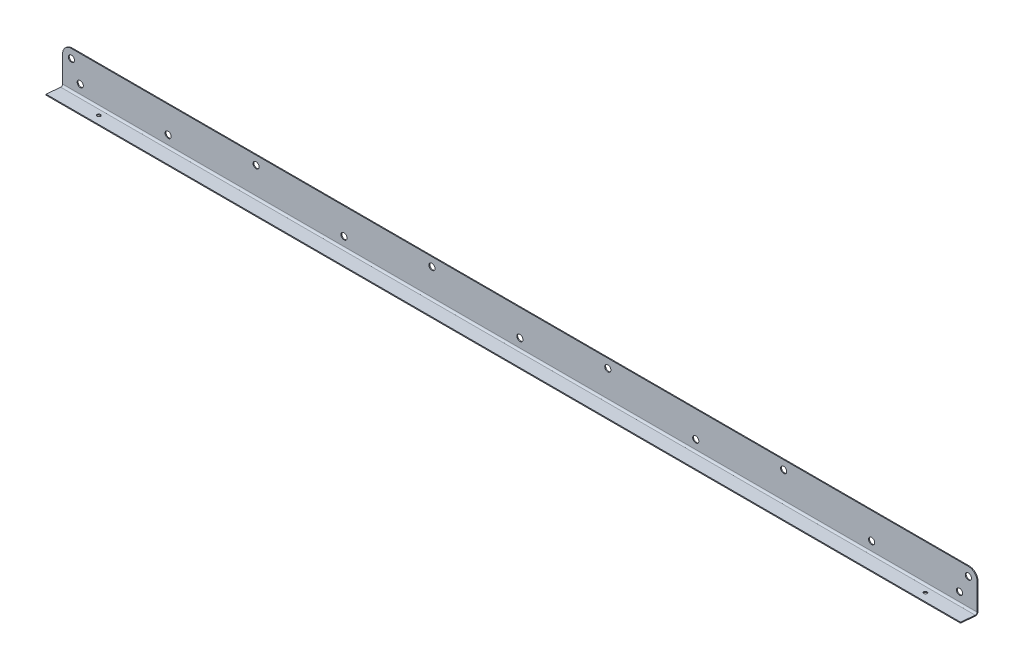
ISO-10303-21;
HEADER;
FILE_DESCRIPTION(('STEP AP214'),'2;1');
FILE_NAME('part.step','',(''),(''),'','','');
FILE_SCHEMA(('AUTOMOTIVE_DESIGN { 1 0 10303 214 1 1 1 1 }'));
ENDSEC;
DATA;
#1=APPLICATION_CONTEXT('core data for automotive mechanical design processes');
#2=APPLICATION_PROTOCOL_DEFINITION('international standard','automotive_design',2000,#1);
#3=PRODUCT_CONTEXT('',#1,'mechanical');
#4=PRODUCT('Part','Part','',(#3));
#5=PRODUCT_RELATED_PRODUCT_CATEGORY('part','',(#4));
#6=PRODUCT_DEFINITION_FORMATION('','',#4);
#7=PRODUCT_DEFINITION_CONTEXT('part definition',#1,'design');
#8=PRODUCT_DEFINITION('design','',#6,#7);
#9=PRODUCT_DEFINITION_SHAPE('','',#8);
#10=(LENGTH_UNIT() NAMED_UNIT(*) SI_UNIT(.MILLI.,.METRE.));
#11=(NAMED_UNIT(*) PLANE_ANGLE_UNIT() SI_UNIT($,.RADIAN.));
#12=(NAMED_UNIT(*) SI_UNIT($,.STERADIAN.) SOLID_ANGLE_UNIT());
#13=UNCERTAINTY_MEASURE_WITH_UNIT(LENGTH_MEASURE(1.E-05),#10,'distance_accuracy_value','');
#14=(GEOMETRIC_REPRESENTATION_CONTEXT(3) GLOBAL_UNCERTAINTY_ASSIGNED_CONTEXT((#13)) GLOBAL_UNIT_ASSIGNED_CONTEXT((#10,
#11,#12)) REPRESENTATION_CONTEXT('',''));
#15=CARTESIAN_POINT('',(0.,0.,0.));
#16=DIRECTION('',(0.,0.,1.));
#17=DIRECTION('',(1.,0.,0.));
#18=AXIS2_PLACEMENT_3D('',#15,#16,#17);
#19=CARTESIAN_POINT('',(510.,20.0000000000001,1.));
#20=DIRECTION('',(0.,1.,0.));
#21=DIRECTION('',(-1.,0.,0.));
#22=AXIS2_PLACEMENT_3D('',#19,#20,#21);
#23=PLANE('',#22);
#24=DIRECTION('',(0.,0.,1.));
#25=VECTOR('',#24,1.);
#26=CARTESIAN_POINT('',(510.,20.0000000000001,1.));
#27=LINE('',#26,#25);
#28=CARTESIAN_POINT('',(510.,20.0000000000001,1.));
#29=VERTEX_POINT('',#28);
#30=CARTESIAN_POINT('',(510.,20.0000000000001,2.));
#31=VERTEX_POINT('',#30);
#32=EDGE_CURVE('E13',#29,#31,#27,.T.);
#33=ORIENTED_EDGE('',*,*,#32,.F.);
#34=DIRECTION('',(-1.,0.,0.));
#35=VECTOR('',#34,1.);
#36=CARTESIAN_POINT('',(510.,20.0000000000001,1.));
#37=LINE('',#36,#35);
#38=CARTESIAN_POINT('',(-510.,20.,1.));
#39=VERTEX_POINT('',#38);
#40=EDGE_CURVE('E244',#29,#39,#37,.T.);
#41=ORIENTED_EDGE('',*,*,#40,.T.);
#42=DIRECTION('',(0.,0.,1.));
#43=VECTOR('',#42,1.);
#44=CARTESIAN_POINT('',(-510.,20.,1.));
#45=LINE('',#44,#43);
#46=CARTESIAN_POINT('',(-510.,20.,2.));
#47=VERTEX_POINT('',#46);
#48=EDGE_CURVE('E73',#39,#47,#45,.T.);
#49=ORIENTED_EDGE('',*,*,#48,.T.);
#50=DIRECTION('',(1.,0.,0.));
#51=VECTOR('',#50,1.);
#52=CARTESIAN_POINT('',(510.,20.0000000000001,2.));
#53=LINE('',#52,#51);
#54=EDGE_CURVE('E201',#31,#47,#53,.F.);
#55=ORIENTED_EDGE('',*,*,#54,.F.);
#56=EDGE_LOOP('',(#33,#41,#49,#55));
#57=FACE_BOUND('',#56,.T.);
#58=ADVANCED_FACE('F63',(#57),#23,.T.);
#59=CARTESIAN_POINT('',(-510.,9.99999999999996,1.));
#60=DIRECTION('',(0.,0.,1.));
#61=DIRECTION('',(1.,0.,0.));
#62=AXIS2_PLACEMENT_3D('',#59,#60,#61);
#63=CYLINDRICAL_SURFACE('',#62,10.);
#64=ORIENTED_EDGE('',*,*,#48,.F.);
#65=CARTESIAN_POINT('',(-510.,9.99999999999996,1.));
#66=DIRECTION('',(0.,0.,1.));
#67=DIRECTION('',(1.,0.,0.));
#68=AXIS2_PLACEMENT_3D('',#65,#66,#67);
#69=CIRCLE('',#68,10.);
#70=CARTESIAN_POINT('',(-520.,9.99999999999989,1.));
#71=VERTEX_POINT('',#70);
#72=EDGE_CURVE('E125',#39,#71,#69,.T.);
#73=ORIENTED_EDGE('',*,*,#72,.T.);
#74=DIRECTION('',(0.,0.,1.));
#75=VECTOR('',#74,1.);
#76=CARTESIAN_POINT('',(-520.,9.99999999999989,1.));
#77=LINE('',#76,#75);
#78=CARTESIAN_POINT('',(-520.,9.99999999999989,2.));
#79=VERTEX_POINT('',#78);
#80=EDGE_CURVE('E113',#71,#79,#77,.T.);
#81=ORIENTED_EDGE('',*,*,#80,.T.);
#82=CARTESIAN_POINT('',(-510.,9.99999999999996,2.));
#83=DIRECTION('',(0.,0.,1.));
#84=DIRECTION('',(1.,0.,0.));
#85=AXIS2_PLACEMENT_3D('',#82,#83,#84);
#86=CIRCLE('',#85,10.);
#87=EDGE_CURVE('E198',#47,#79,#86,.T.);
#88=ORIENTED_EDGE('',*,*,#87,.F.);
#89=EDGE_LOOP('',(#64,#73,#81,#88));
#90=FACE_BOUND('',#89,.T.);
#91=ADVANCED_FACE('F279',(#90),#63,.T.);
#92=CARTESIAN_POINT('',(-520.,-20.,1.));
#93=DIRECTION('',(-1.,0.,0.));
#94=DIRECTION('',(0.,-1.,0.));
#95=AXIS2_PLACEMENT_3D('',#92,#93,#94);
#96=PLANE('',#95);
#97=ORIENTED_EDGE('',*,*,#80,.F.);
#98=DIRECTION('',(0.,-1.,0.));
#99=VECTOR('',#98,1.);
#100=CARTESIAN_POINT('',(-520.,-20.,1.));
#101=LINE('',#100,#99);
#102=CARTESIAN_POINT('',(-520.,-20.,1.));
#103=VERTEX_POINT('',#102);
#104=EDGE_CURVE('E115',#71,#103,#101,.T.);
#105=ORIENTED_EDGE('',*,*,#104,.T.);
#106=DIRECTION('',(0.,0.,1.));
#107=VECTOR('',#106,1.);
#108=CARTESIAN_POINT('',(-520.,-20.,1.));
#109=LINE('',#108,#107);
#110=CARTESIAN_POINT('',(-520.,-20.,2.));
#111=VERTEX_POINT('',#110);
#112=EDGE_CURVE('E119',#103,#111,#109,.T.);
#113=ORIENTED_EDGE('',*,*,#112,.T.);
#114=DIRECTION('',(0.,1.,0.));
#115=VECTOR('',#114,1.);
#116=CARTESIAN_POINT('',(-520.,10.0000000000001,2.));
#117=LINE('',#116,#115);
#118=EDGE_CURVE('E196',#79,#111,#117,.F.);
#119=ORIENTED_EDGE('',*,*,#118,.F.);
#120=EDGE_LOOP('',(#97,#105,#113,#119));
#121=FACE_BOUND('',#120,.T.);
#122=ADVANCED_FACE('F117',(#121),#96,.T.);
#123=CARTESIAN_POINT('',(520.,-19.9999999999999,1.));
#124=DIRECTION('',(1.,0.,0.));
#125=DIRECTION('',(0.,1.,0.));
#126=AXIS2_PLACEMENT_3D('',#123,#124,#125);
#127=PLANE('',#126);
#128=DIRECTION('',(0.,0.,1.));
#129=VECTOR('',#128,1.);
#130=CARTESIAN_POINT('',(520.,-19.9999999999999,1.));
#131=LINE('',#130,#129);
#132=CARTESIAN_POINT('',(520.,-19.9999999999999,0.999999999999902));
#133=VERTEX_POINT('',#132);
#134=CARTESIAN_POINT('',(520.,-19.9999999999999,2.));
#135=VERTEX_POINT('',#134);
#136=EDGE_CURVE('E150',#133,#135,#131,.T.);
#137=ORIENTED_EDGE('',*,*,#136,.F.);
#138=DIRECTION('',(0.,1.,0.));
#139=VECTOR('',#138,1.);
#140=CARTESIAN_POINT('',(520.,-19.9999999999999,1.));
#141=LINE('',#140,#139);
#142=CARTESIAN_POINT('',(520.,10.,1.));
#143=VERTEX_POINT('',#142);
#144=EDGE_CURVE('E133',#133,#143,#141,.T.);
#145=ORIENTED_EDGE('',*,*,#144,.T.);
#146=DIRECTION('',(0.,0.,1.));
#147=VECTOR('',#146,1.);
#148=CARTESIAN_POINT('',(520.,10.,1.));
#149=LINE('',#148,#147);
#150=CARTESIAN_POINT('',(520.,10.,2.));
#151=VERTEX_POINT('',#150);
#152=EDGE_CURVE('E67',#143,#151,#149,.T.);
#153=ORIENTED_EDGE('',*,*,#152,.T.);
#154=DIRECTION('',(0.,1.,0.));
#155=VECTOR('',#154,1.);
#156=CARTESIAN_POINT('',(520.,10.0000000000001,2.));
#157=LINE('',#156,#155);
#158=EDGE_CURVE('E81',#135,#151,#157,.T.);
#159=ORIENTED_EDGE('',*,*,#158,.F.);
#160=EDGE_LOOP('',(#137,#145,#153,#159));
#161=FACE_BOUND('',#160,.T.);
#162=ADVANCED_FACE('F282',(#161),#127,.T.);
#163=CARTESIAN_POINT('',(400.,-10.0000000000001,1.));
#164=DIRECTION('',(0.,0.,1.));
#165=DIRECTION('',(1.,0.,0.));
#166=AXIS2_PLACEMENT_3D('',#163,#164,#165);
#167=CYLINDRICAL_SURFACE('',#166,3.50000000000002);
#168=CARTESIAN_POINT('',(400.,-10.0000000000001,2.));
#169=DIRECTION('',(0.,0.,1.));
#170=DIRECTION('',(1.,0.,0.));
#171=AXIS2_PLACEMENT_3D('',#168,#169,#170);
#172=CIRCLE('',#171,3.50000000000002);
#173=CARTESIAN_POINT('',(403.5,-10.0000000000001,2.));
#174=VERTEX_POINT('',#173);
#175=EDGE_CURVE('E172',#174,#174,#172,.T.);
#176=ORIENTED_EDGE('',*,*,#175,.T.);
#177=EDGE_LOOP('',(#176));
#178=FACE_BOUND('',#177,.T.);
#179=CARTESIAN_POINT('',(400.,-10.0000000000001,1.));
#180=DIRECTION('',(0.,0.,1.));
#181=DIRECTION('',(1.,0.,0.));
#182=AXIS2_PLACEMENT_3D('',#179,#180,#181);
#183=CIRCLE('',#182,3.50000000000002);
#184=CARTESIAN_POINT('',(403.5,-10.0000000000001,1.));
#185=VERTEX_POINT('',#184);
#186=EDGE_CURVE('E156',#185,#185,#183,.T.);
#187=ORIENTED_EDGE('',*,*,#186,.F.);
#188=EDGE_LOOP('',(#187));
#189=FACE_BOUND('',#188,.T.);
#190=ADVANCED_FACE('F429',(#178,#189),#167,.F.);
#191=CARTESIAN_POINT('',(-1.11022302462516E-13,-10.0000000000001,1.));
#192=DIRECTION('',(0.,0.,1.));
#193=DIRECTION('',(1.,0.,0.));
#194=AXIS2_PLACEMENT_3D('',#191,#192,#193);
#195=CYLINDRICAL_SURFACE('',#194,3.50000000000002);
#196=CARTESIAN_POINT('',(-1.11022302462516E-13,-10.0000000000001,2.));
#197=DIRECTION('',(0.,0.,1.));
#198=DIRECTION('',(1.,0.,0.));
#199=AXIS2_PLACEMENT_3D('',#196,#197,#198);
#200=CIRCLE('',#199,3.50000000000002);
#201=CARTESIAN_POINT('',(3.49999999999991,-10.0000000000001,2.));
#202=VERTEX_POINT('',#201);
#203=EDGE_CURVE('E175',#202,#202,#200,.T.);
#204=ORIENTED_EDGE('',*,*,#203,.T.);
#205=EDGE_LOOP('',(#204));
#206=FACE_BOUND('',#205,.T.);
#207=CARTESIAN_POINT('',(-1.11022302462516E-13,-10.0000000000001,1.));
#208=DIRECTION('',(0.,0.,1.));
#209=DIRECTION('',(1.,0.,0.));
#210=AXIS2_PLACEMENT_3D('',#207,#208,#209);
#211=CIRCLE('',#210,3.50000000000002);
#212=CARTESIAN_POINT('',(3.49999999999991,-10.0000000000001,1.));
#213=VERTEX_POINT('',#212);
#214=EDGE_CURVE('E160',#213,#213,#211,.T.);
#215=ORIENTED_EDGE('',*,*,#214,.F.);
#216=EDGE_LOOP('',(#215));
#217=FACE_BOUND('',#216,.T.);
#218=ADVANCED_FACE('F432',(#206,#217),#195,.F.);
#219=CARTESIAN_POINT('',(-500.,-10.0000000000001,1.));
#220=DIRECTION('',(0.,0.,1.));
#221=DIRECTION('',(1.,0.,0.));
#222=AXIS2_PLACEMENT_3D('',#219,#220,#221);
#223=CYLINDRICAL_SURFACE('',#222,3.50000000000002);
#224=CARTESIAN_POINT('',(-500.,-10.0000000000001,2.));
#225=DIRECTION('',(0.,0.,1.));
#226=DIRECTION('',(1.,0.,0.));
#227=AXIS2_PLACEMENT_3D('',#224,#225,#226);
#228=CIRCLE('',#227,3.50000000000002);
#229=CARTESIAN_POINT('',(-496.5,-10.0000000000001,2.));
#230=VERTEX_POINT('',#229);
#231=EDGE_CURVE('E179',#230,#230,#228,.T.);
#232=ORIENTED_EDGE('',*,*,#231,.T.);
#233=EDGE_LOOP('',(#232));
#234=FACE_BOUND('',#233,.T.);
#235=CARTESIAN_POINT('',(-500.,-10.0000000000001,1.));
#236=DIRECTION('',(0.,0.,1.));
#237=DIRECTION('',(1.,0.,0.));
#238=AXIS2_PLACEMENT_3D('',#235,#236,#237);
#239=CIRCLE('',#238,3.50000000000002);
#240=CARTESIAN_POINT('',(-496.5,-10.0000000000001,1.));
#241=VERTEX_POINT('',#240);
#242=EDGE_CURVE('E228',#241,#241,#239,.T.);
#243=ORIENTED_EDGE('',*,*,#242,.F.);
#244=EDGE_LOOP('',(#243));
#245=FACE_BOUND('',#244,.T.);
#246=ADVANCED_FACE('F436',(#234,#245),#223,.F.);
#247=CARTESIAN_POINT('',(-510.,9.99999999999995,1.));
#248=DIRECTION('',(0.,0.,1.));
#249=DIRECTION('',(1.,0.,0.));
#250=AXIS2_PLACEMENT_3D('',#247,#248,#249);
#251=CYLINDRICAL_SURFACE('',#250,3.50000000000008);
#252=CARTESIAN_POINT('',(-510.,9.99999999999995,2.));
#253=DIRECTION('',(0.,0.,1.));
#254=DIRECTION('',(1.,0.,0.));
#255=AXIS2_PLACEMENT_3D('',#252,#253,#254);
#256=CIRCLE('',#255,3.50000000000008);
#257=CARTESIAN_POINT('',(-506.5,9.99999999999995,2.));
#258=VERTEX_POINT('',#257);
#259=EDGE_CURVE('E182',#258,#258,#256,.T.);
#260=ORIENTED_EDGE('',*,*,#259,.T.);
#261=EDGE_LOOP('',(#260));
#262=FACE_BOUND('',#261,.T.);
#263=CARTESIAN_POINT('',(-510.,9.99999999999995,1.));
#264=DIRECTION('',(0.,0.,1.));
#265=DIRECTION('',(1.,0.,0.));
#266=AXIS2_PLACEMENT_3D('',#263,#264,#265);
#267=CIRCLE('',#266,3.50000000000008);
#268=CARTESIAN_POINT('',(-506.5,9.99999999999995,1.));
#269=VERTEX_POINT('',#268);
#270=EDGE_CURVE('E231',#269,#269,#267,.T.);
#271=ORIENTED_EDGE('',*,*,#270,.F.);
#272=EDGE_LOOP('',(#271));
#273=FACE_BOUND('',#272,.T.);
#274=ADVANCED_FACE('F440',(#262,#273),#251,.F.);
#275=CARTESIAN_POINT('',(99.9999999999999,9.99999999999995,1.));
#276=DIRECTION('',(0.,0.,1.));
#277=DIRECTION('',(1.,0.,0.));
#278=AXIS2_PLACEMENT_3D('',#275,#276,#277);
#279=CYLINDRICAL_SURFACE('',#278,3.49999999999996);
#280=CARTESIAN_POINT('',(99.9999999999999,9.99999999999995,2.));
#281=DIRECTION('',(0.,0.,1.));
#282=DIRECTION('',(1.,0.,0.));
#283=AXIS2_PLACEMENT_3D('',#280,#281,#282);
#284=CIRCLE('',#283,3.49999999999996);
#285=CARTESIAN_POINT('',(103.5,9.99999999999995,2.));
#286=VERTEX_POINT('',#285);
#287=EDGE_CURVE('E185',#286,#286,#284,.T.);
#288=ORIENTED_EDGE('',*,*,#287,.T.);
#289=EDGE_LOOP('',(#288));
#290=FACE_BOUND('',#289,.T.);
#291=CARTESIAN_POINT('',(99.9999999999999,9.99999999999995,1.));
#292=DIRECTION('',(0.,0.,1.));
#293=DIRECTION('',(1.,0.,0.));
#294=AXIS2_PLACEMENT_3D('',#291,#292,#293);
#295=CIRCLE('',#294,3.49999999999996);
#296=CARTESIAN_POINT('',(103.5,9.99999999999995,1.));
#297=VERTEX_POINT('',#296);
#298=EDGE_CURVE('E234',#297,#297,#295,.T.);
#299=ORIENTED_EDGE('',*,*,#298,.F.);
#300=EDGE_LOOP('',(#299));
#301=FACE_BOUND('',#300,.T.);
#302=ADVANCED_FACE('F444',(#290,#301),#279,.F.);
#303=CARTESIAN_POINT('',(-400.,-10.0000000000001,1.));
#304=DIRECTION('',(0.,0.,1.));
#305=DIRECTION('',(1.,0.,0.));
#306=AXIS2_PLACEMENT_3D('',#303,#304,#305);
#307=CYLINDRICAL_SURFACE('',#306,3.50000000000002);
#308=CARTESIAN_POINT('',(-400.,-10.0000000000001,2.));
#309=DIRECTION('',(0.,0.,1.));
#310=DIRECTION('',(1.,0.,0.));
#311=AXIS2_PLACEMENT_3D('',#308,#309,#310);
#312=CIRCLE('',#311,3.50000000000002);
#313=CARTESIAN_POINT('',(-396.5,-10.0000000000001,2.));
#314=VERTEX_POINT('',#313);
#315=EDGE_CURVE('E188',#314,#314,#312,.T.);
#316=ORIENTED_EDGE('',*,*,#315,.T.);
#317=EDGE_LOOP('',(#316));
#318=FACE_BOUND('',#317,.T.);
#319=CARTESIAN_POINT('',(-400.,-10.0000000000001,1.));
#320=DIRECTION('',(0.,0.,1.));
#321=DIRECTION('',(1.,0.,0.));
#322=AXIS2_PLACEMENT_3D('',#319,#320,#321);
#323=CIRCLE('',#322,3.50000000000002);
#324=CARTESIAN_POINT('',(-396.5,-10.0000000000001,1.));
#325=VERTEX_POINT('',#324);
#326=EDGE_CURVE('E237',#325,#325,#323,.T.);
#327=ORIENTED_EDGE('',*,*,#326,.F.);
#328=EDGE_LOOP('',(#327));
#329=FACE_BOUND('',#328,.T.);
#330=ADVANCED_FACE('F383',(#318,#329),#307,.F.);
#331=CARTESIAN_POINT('',(510.,10.0000000000001,1.));
#332=DIRECTION('',(0.,0.,1.));
#333=DIRECTION('',(1.,0.,0.));
#334=AXIS2_PLACEMENT_3D('',#331,#332,#333);
#335=CYLINDRICAL_SURFACE('',#334,10.);
#336=CARTESIAN_POINT('',(510.,10.0000000000001,1.));
#337=DIRECTION('',(0.,0.,1.));
#338=DIRECTION('',(1.,0.,0.));
#339=AXIS2_PLACEMENT_3D('',#336,#337,#338);
#340=CIRCLE('',#339,10.);
#341=EDGE_CURVE('E241',#143,#29,#340,.T.);
#342=ORIENTED_EDGE('',*,*,#341,.T.);
#343=ORIENTED_EDGE('',*,*,#32,.T.);
#344=CARTESIAN_POINT('',(510.,10.0000000000001,2.));
#345=DIRECTION('',(0.,0.,1.));
#346=DIRECTION('',(1.,0.,0.));
#347=AXIS2_PLACEMENT_3D('',#344,#345,#346);
#348=CIRCLE('',#347,10.);
#349=EDGE_CURVE('E192',#151,#31,#348,.T.);
#350=ORIENTED_EDGE('',*,*,#349,.F.);
#351=ORIENTED_EDGE('',*,*,#152,.F.);
#352=EDGE_LOOP('',(#342,#343,#350,#351));
#353=FACE_BOUND('',#352,.T.);
#354=ADVANCED_FACE('F281',(#353),#335,.T.);
#355=CARTESIAN_POINT('',(-300.,9.99999999999995,1.));
#356=DIRECTION('',(0.,0.,1.));
#357=DIRECTION('',(1.,0.,0.));
#358=AXIS2_PLACEMENT_3D('',#355,#356,#357);
#359=CYLINDRICAL_SURFACE('',#358,3.49999999999996);
#360=CARTESIAN_POINT('',(-300.,9.99999999999995,2.));
#361=DIRECTION('',(0.,0.,1.));
#362=DIRECTION('',(1.,0.,0.));
#363=AXIS2_PLACEMENT_3D('',#360,#361,#362);
#364=CIRCLE('',#363,3.49999999999996);
#365=CARTESIAN_POINT('',(-296.5,9.99999999999995,2.));
#366=VERTEX_POINT('',#365);
#367=EDGE_CURVE('E195',#366,#366,#364,.T.);
#368=ORIENTED_EDGE('',*,*,#367,.T.);
#369=EDGE_LOOP('',(#368));
#370=FACE_BOUND('',#369,.T.);
#371=CARTESIAN_POINT('',(-300.,9.99999999999995,1.));
#372=DIRECTION('',(0.,0.,1.));
#373=DIRECTION('',(1.,0.,0.));
#374=AXIS2_PLACEMENT_3D('',#371,#372,#373);
#375=CIRCLE('',#374,3.49999999999996);
#376=CARTESIAN_POINT('',(-296.5,9.99999999999995,1.));
#377=VERTEX_POINT('',#376);
#378=EDGE_CURVE('E138',#377,#377,#375,.T.);
#379=ORIENTED_EDGE('',*,*,#378,.F.);
#380=EDGE_LOOP('',(#379));
#381=FACE_BOUND('',#380,.T.);
#382=ADVANCED_FACE('F382',(#370,#381),#359,.F.);
#383=CARTESIAN_POINT('',(-100.,9.99999999999995,1.));
#384=DIRECTION('',(0.,0.,1.));
#385=DIRECTION('',(1.,0.,0.));
#386=AXIS2_PLACEMENT_3D('',#383,#384,#385);
#387=CYLINDRICAL_SURFACE('',#386,3.49999999999996);
#388=CARTESIAN_POINT('',(-100.,9.99999999999995,2.));
#389=DIRECTION('',(0.,0.,1.));
#390=DIRECTION('',(1.,0.,0.));
#391=AXIS2_PLACEMENT_3D('',#388,#389,#390);
#392=CIRCLE('',#391,3.49999999999996);
#393=CARTESIAN_POINT('',(-96.5000000000002,9.99999999999995,2.));
#394=VERTEX_POINT('',#393);
#395=EDGE_CURVE('E208',#394,#394,#392,.T.);
#396=ORIENTED_EDGE('',*,*,#395,.T.);
#397=EDGE_LOOP('',(#396));
#398=FACE_BOUND('',#397,.T.);
#399=CARTESIAN_POINT('',(-100.,9.99999999999995,1.));
#400=DIRECTION('',(0.,0.,1.));
#401=DIRECTION('',(1.,0.,0.));
#402=AXIS2_PLACEMENT_3D('',#399,#400,#401);
#403=CIRCLE('',#402,3.49999999999996);
#404=CARTESIAN_POINT('',(-96.5000000000002,9.99999999999995,1.));
#405=VERTEX_POINT('',#404);
#406=EDGE_CURVE('E250',#405,#405,#403,.T.);
#407=ORIENTED_EDGE('',*,*,#406,.F.);
#408=EDGE_LOOP('',(#407));
#409=FACE_BOUND('',#408,.T.);
#410=ADVANCED_FACE('F386',(#398,#409),#387,.F.);
#411=CARTESIAN_POINT('',(300.,9.99999999999995,1.));
#412=DIRECTION('',(0.,0.,1.));
#413=DIRECTION('',(1.,0.,0.));
#414=AXIS2_PLACEMENT_3D('',#411,#412,#413);
#415=CYLINDRICAL_SURFACE('',#414,3.49999999999996);
#416=CARTESIAN_POINT('',(300.,9.99999999999995,2.));
#417=DIRECTION('',(0.,0.,1.));
#418=DIRECTION('',(1.,0.,0.));
#419=AXIS2_PLACEMENT_3D('',#416,#417,#418);
#420=CIRCLE('',#419,3.49999999999996);
#421=CARTESIAN_POINT('',(303.5,9.99999999999995,2.));
#422=VERTEX_POINT('',#421);
#423=EDGE_CURVE('E211',#422,#422,#420,.T.);
#424=ORIENTED_EDGE('',*,*,#423,.T.);
#425=EDGE_LOOP('',(#424));
#426=FACE_BOUND('',#425,.T.);
#427=CARTESIAN_POINT('',(300.,9.99999999999995,1.));
#428=DIRECTION('',(0.,0.,1.));
#429=DIRECTION('',(1.,0.,0.));
#430=AXIS2_PLACEMENT_3D('',#427,#428,#429);
#431=CIRCLE('',#430,3.49999999999996);
#432=CARTESIAN_POINT('',(303.5,9.99999999999995,1.));
#433=VERTEX_POINT('',#432);
#434=EDGE_CURVE('E253',#433,#433,#431,.T.);
#435=ORIENTED_EDGE('',*,*,#434,.F.);
#436=EDGE_LOOP('',(#435));
#437=FACE_BOUND('',#436,.T.);
#438=ADVANCED_FACE('F390',(#426,#437),#415,.F.);
#439=CARTESIAN_POINT('',(510.,9.99999999999995,1.));
#440=DIRECTION('',(0.,0.,1.));
#441=DIRECTION('',(1.,0.,0.));
#442=AXIS2_PLACEMENT_3D('',#439,#440,#441);
#443=CYLINDRICAL_SURFACE('',#442,3.50000000000008);
#444=CARTESIAN_POINT('',(510.,9.99999999999995,2.));
#445=DIRECTION('',(0.,0.,1.));
#446=DIRECTION('',(1.,0.,0.));
#447=AXIS2_PLACEMENT_3D('',#444,#445,#446);
#448=CIRCLE('',#447,3.50000000000008);
#449=CARTESIAN_POINT('',(513.5,9.99999999999995,2.));
#450=VERTEX_POINT('',#449);
#451=EDGE_CURVE('E214',#450,#450,#448,.T.);
#452=ORIENTED_EDGE('',*,*,#451,.T.);
#453=EDGE_LOOP('',(#452));
#454=FACE_BOUND('',#453,.T.);
#455=CARTESIAN_POINT('',(510.,9.99999999999995,1.));
#456=DIRECTION('',(0.,0.,1.));
#457=DIRECTION('',(1.,0.,0.));
#458=AXIS2_PLACEMENT_3D('',#455,#456,#457);
#459=CIRCLE('',#458,3.50000000000008);
#460=CARTESIAN_POINT('',(513.5,9.99999999999995,1.));
#461=VERTEX_POINT('',#460);
#462=EDGE_CURVE('E256',#461,#461,#459,.T.);
#463=ORIENTED_EDGE('',*,*,#462,.F.);
#464=EDGE_LOOP('',(#463));
#465=FACE_BOUND('',#464,.T.);
#466=ADVANCED_FACE('F394',(#454,#465),#443,.F.);
#467=CARTESIAN_POINT('',(-200.,-10.0000000000001,1.));
#468=DIRECTION('',(0.,0.,1.));
#469=DIRECTION('',(1.,0.,0.));
#470=AXIS2_PLACEMENT_3D('',#467,#468,#469);
#471=CYLINDRICAL_SURFACE('',#470,3.50000000000002);
#472=CARTESIAN_POINT('',(-200.,-10.0000000000001,2.));
#473=DIRECTION('',(0.,0.,1.));
#474=DIRECTION('',(1.,0.,0.));
#475=AXIS2_PLACEMENT_3D('',#472,#473,#474);
#476=CIRCLE('',#475,3.50000000000002);
#477=CARTESIAN_POINT('',(-196.5,-10.0000000000001,2.));
#478=VERTEX_POINT('',#477);
#479=EDGE_CURVE('E217',#478,#478,#476,.T.);
#480=ORIENTED_EDGE('',*,*,#479,.T.);
#481=EDGE_LOOP('',(#480));
#482=FACE_BOUND('',#481,.T.);
#483=CARTESIAN_POINT('',(-200.,-10.0000000000001,1.));
#484=DIRECTION('',(0.,0.,1.));
#485=DIRECTION('',(1.,0.,0.));
#486=AXIS2_PLACEMENT_3D('',#483,#484,#485);
#487=CIRCLE('',#486,3.50000000000002);
#488=CARTESIAN_POINT('',(-196.5,-10.0000000000001,1.));
#489=VERTEX_POINT('',#488);
#490=EDGE_CURVE('E259',#489,#489,#487,.T.);
#491=ORIENTED_EDGE('',*,*,#490,.F.);
#492=EDGE_LOOP('',(#491));
#493=FACE_BOUND('',#492,.T.);
#494=ADVANCED_FACE('F398',(#482,#493),#471,.F.);
#495=CARTESIAN_POINT('',(200.,-10.0000000000001,1.));
#496=DIRECTION('',(0.,0.,1.));
#497=DIRECTION('',(1.,0.,0.));
#498=AXIS2_PLACEMENT_3D('',#495,#496,#497);
#499=CYLINDRICAL_SURFACE('',#498,3.50000000000002);
#500=CARTESIAN_POINT('',(200.,-10.0000000000001,2.));
#501=DIRECTION('',(0.,0.,1.));
#502=DIRECTION('',(1.,0.,0.));
#503=AXIS2_PLACEMENT_3D('',#500,#501,#502);
#504=CIRCLE('',#503,3.50000000000002);
#505=CARTESIAN_POINT('',(203.5,-10.0000000000001,2.));
#506=VERTEX_POINT('',#505);
#507=EDGE_CURVE('E220',#506,#506,#504,.T.);
#508=ORIENTED_EDGE('',*,*,#507,.T.);
#509=EDGE_LOOP('',(#508));
#510=FACE_BOUND('',#509,.T.);
#511=CARTESIAN_POINT('',(200.,-10.0000000000001,1.));
#512=DIRECTION('',(0.,0.,1.));
#513=DIRECTION('',(1.,0.,0.));
#514=AXIS2_PLACEMENT_3D('',#511,#512,#513);
#515=CIRCLE('',#514,3.50000000000002);
#516=CARTESIAN_POINT('',(203.5,-10.0000000000001,1.));
#517=VERTEX_POINT('',#516);
#518=EDGE_CURVE('E262',#517,#517,#515,.T.);
#519=ORIENTED_EDGE('',*,*,#518,.F.);
#520=EDGE_LOOP('',(#519));
#521=FACE_BOUND('',#520,.T.);
#522=ADVANCED_FACE('F401',(#510,#521),#499,.F.);
#523=CARTESIAN_POINT('',(500.,-10.0000000000001,1.));
#524=DIRECTION('',(0.,0.,1.));
#525=DIRECTION('',(1.,0.,0.));
#526=AXIS2_PLACEMENT_3D('',#523,#524,#525);
#527=CYLINDRICAL_SURFACE('',#526,3.50000000000007);
#528=CARTESIAN_POINT('',(500.,-10.0000000000001,2.));
#529=DIRECTION('',(0.,0.,1.));
#530=DIRECTION('',(1.,0.,0.));
#531=AXIS2_PLACEMENT_3D('',#528,#529,#530);
#532=CIRCLE('',#531,3.50000000000007);
#533=CARTESIAN_POINT('',(503.5,-10.0000000000001,2.));
#534=VERTEX_POINT('',#533);
#535=EDGE_CURVE('E223',#534,#534,#532,.T.);
#536=ORIENTED_EDGE('',*,*,#535,.T.);
#537=EDGE_LOOP('',(#536));
#538=FACE_BOUND('',#537,.T.);
#539=CARTESIAN_POINT('',(500.,-10.0000000000001,1.));
#540=DIRECTION('',(0.,0.,1.));
#541=DIRECTION('',(1.,0.,0.));
#542=AXIS2_PLACEMENT_3D('',#539,#540,#541);
#543=CIRCLE('',#542,3.50000000000007);
#544=CARTESIAN_POINT('',(503.5,-10.0000000000001,1.));
#545=VERTEX_POINT('',#544);
#546=EDGE_CURVE('E176',#545,#545,#543,.T.);
#547=ORIENTED_EDGE('',*,*,#546,.F.);
#548=EDGE_LOOP('',(#547));
#549=FACE_BOUND('',#548,.T.);
#550=ADVANCED_FACE('F65',(#538,#549),#527,.F.);
#551=CARTESIAN_POINT('',(510.,10.0000000000001,2.));
#552=DIRECTION('',(0.,0.,1.));
#553=DIRECTION('',(1.,0.,0.));
#554=AXIS2_PLACEMENT_3D('',#551,#552,#553);
#555=PLANE('',#554);
#556=ORIENTED_EDGE('',*,*,#175,.F.);
#557=EDGE_LOOP('',(#556));
#558=FACE_BOUND('',#557,.T.);
#559=ORIENTED_EDGE('',*,*,#203,.F.);
#560=EDGE_LOOP('',(#559));
#561=FACE_BOUND('',#560,.T.);
#562=ORIENTED_EDGE('',*,*,#231,.F.);
#563=EDGE_LOOP('',(#562));
#564=FACE_BOUND('',#563,.T.);
#565=ORIENTED_EDGE('',*,*,#259,.F.);
#566=EDGE_LOOP('',(#565));
#567=FACE_BOUND('',#566,.T.);
#568=ORIENTED_EDGE('',*,*,#287,.F.);
#569=EDGE_LOOP('',(#568));
#570=FACE_BOUND('',#569,.T.);
#571=ORIENTED_EDGE('',*,*,#315,.F.);
#572=EDGE_LOOP('',(#571));
#573=FACE_BOUND('',#572,.T.);
#574=ORIENTED_EDGE('',*,*,#158,.T.);
#575=ORIENTED_EDGE('',*,*,#349,.T.);
#576=ORIENTED_EDGE('',*,*,#54,.T.);
#577=ORIENTED_EDGE('',*,*,#87,.T.);
#578=ORIENTED_EDGE('',*,*,#118,.T.);
#579=DIRECTION('',(1.,0.,0.));
#580=VECTOR('',#579,1.);
#581=CARTESIAN_POINT('',(510.,-20.,2.));
#582=LINE('',#581,#580);
#583=EDGE_CURVE('E193',#111,#135,#582,.T.);
#584=ORIENTED_EDGE('',*,*,#583,.T.);
#585=EDGE_LOOP('',(#574,#575,#576,#577,#578,#584));
#586=FACE_BOUND('',#585,.T.);
#587=ORIENTED_EDGE('',*,*,#367,.F.);
#588=EDGE_LOOP('',(#587));
#589=FACE_BOUND('',#588,.T.);
#590=ORIENTED_EDGE('',*,*,#395,.F.);
#591=EDGE_LOOP('',(#590));
#592=FACE_BOUND('',#591,.T.);
#593=ORIENTED_EDGE('',*,*,#423,.F.);
#594=EDGE_LOOP('',(#593));
#595=FACE_BOUND('',#594,.T.);
#596=ORIENTED_EDGE('',*,*,#451,.F.);
#597=EDGE_LOOP('',(#596));
#598=FACE_BOUND('',#597,.T.);
#599=ORIENTED_EDGE('',*,*,#479,.F.);
#600=EDGE_LOOP('',(#599));
#601=FACE_BOUND('',#600,.T.);
#602=ORIENTED_EDGE('',*,*,#507,.F.);
#603=EDGE_LOOP('',(#602));
#604=FACE_BOUND('',#603,.T.);
#605=ORIENTED_EDGE('',*,*,#535,.F.);
#606=EDGE_LOOP('',(#605));
#607=FACE_BOUND('',#606,.T.);
#608=ADVANCED_FACE('F276',(#558,#561,#564,#567,#570,#573,#586,#589,#592,#595,#598,#601,#604,
#607),#555,.T.);
#609=CARTESIAN_POINT('',(510.,10.0000000000001,1.));
#610=DIRECTION('',(0.,0.,1.));
#611=DIRECTION('',(1.,0.,0.));
#612=AXIS2_PLACEMENT_3D('',#609,#610,#611);
#613=PLANE('',#612);
#614=ORIENTED_EDGE('',*,*,#186,.T.);
#615=EDGE_LOOP('',(#614));
#616=FACE_BOUND('',#615,.T.);
#617=ORIENTED_EDGE('',*,*,#214,.T.);
#618=EDGE_LOOP('',(#617));
#619=FACE_BOUND('',#618,.T.);
#620=ORIENTED_EDGE('',*,*,#242,.T.);
#621=EDGE_LOOP('',(#620));
#622=FACE_BOUND('',#621,.T.);
#623=ORIENTED_EDGE('',*,*,#270,.T.);
#624=EDGE_LOOP('',(#623));
#625=FACE_BOUND('',#624,.T.);
#626=ORIENTED_EDGE('',*,*,#298,.T.);
#627=EDGE_LOOP('',(#626));
#628=FACE_BOUND('',#627,.T.);
#629=ORIENTED_EDGE('',*,*,#326,.T.);
#630=EDGE_LOOP('',(#629));
#631=FACE_BOUND('',#630,.T.);
#632=ORIENTED_EDGE('',*,*,#144,.F.);
#633=DIRECTION('',(1.,0.,0.));
#634=VECTOR('',#633,1.);
#635=CARTESIAN_POINT('',(520.,-19.9999999999999,1.));
#636=LINE('',#635,#634);
#637=EDGE_CURVE('E124',#103,#133,#636,.T.);
#638=ORIENTED_EDGE('',*,*,#637,.F.);
#639=ORIENTED_EDGE('',*,*,#104,.F.);
#640=ORIENTED_EDGE('',*,*,#72,.F.);
#641=ORIENTED_EDGE('',*,*,#40,.F.);
#642=ORIENTED_EDGE('',*,*,#341,.F.);
#643=EDGE_LOOP('',(#632,#638,#639,#640,#641,#642));
#644=FACE_BOUND('',#643,.T.);
#645=ORIENTED_EDGE('',*,*,#378,.T.);
#646=EDGE_LOOP('',(#645));
#647=FACE_BOUND('',#646,.T.);
#648=ORIENTED_EDGE('',*,*,#406,.T.);
#649=EDGE_LOOP('',(#648));
#650=FACE_BOUND('',#649,.T.);
#651=ORIENTED_EDGE('',*,*,#434,.T.);
#652=EDGE_LOOP('',(#651));
#653=FACE_BOUND('',#652,.T.);
#654=ORIENTED_EDGE('',*,*,#462,.T.);
#655=EDGE_LOOP('',(#654));
#656=FACE_BOUND('',#655,.T.);
#657=ORIENTED_EDGE('',*,*,#490,.T.);
#658=EDGE_LOOP('',(#657));
#659=FACE_BOUND('',#658,.T.);
#660=ORIENTED_EDGE('',*,*,#518,.T.);
#661=EDGE_LOOP('',(#660));
#662=FACE_BOUND('',#661,.T.);
#663=ORIENTED_EDGE('',*,*,#546,.T.);
#664=EDGE_LOOP('',(#663));
#665=FACE_BOUND('',#664,.T.);
#666=ADVANCED_FACE('F129',(#616,#619,#622,#625,#628,#631,#644,#647,#650,#653,#656,#659,#662,
#665),#613,.F.);
#667=CARTESIAN_POINT('',(-520.,-20.,3.99999999999998));
#668=DIRECTION('',(-1.,0.,0.));
#669=DIRECTION('',(0.,0.,1.));
#670=AXIS2_PLACEMENT_3D('',#667,#668,#669);
#671=PLANE('',#670);
#672=DIRECTION('',(0.,0.996194698091746,-0.0871557427476548));
#673=VECTOR('',#672,1.);
#674=CARTESIAN_POINT('',(-520.,-22.9885840942753,4.26146722824297));
#675=LINE('',#674,#673);
#676=CARTESIAN_POINT('',(-520.,-21.9923893961836,4.1743114854953));
#677=VERTEX_POINT('',#676);
#678=CARTESIAN_POINT('',(-520.,-22.9885840942753,4.26146722824295));
#679=VERTEX_POINT('',#678);
#680=EDGE_CURVE('E164',#677,#679,#675,.F.);
#681=ORIENTED_EDGE('',*,*,#680,.F.);
#682=CARTESIAN_POINT('',(-520.,-20.,3.99999999999998));
#683=DIRECTION('',(1.,0.,0.));
#684=DIRECTION('',(0.,0.,-1.));
#685=AXIS2_PLACEMENT_3D('',#682,#683,#684);
#686=CIRCLE('',#685,2.00000000000008);
#687=EDGE_CURVE('E149',#111,#677,#686,.F.);
#688=ORIENTED_EDGE('',*,*,#687,.F.);
#689=ORIENTED_EDGE('',*,*,#112,.F.);
#690=CARTESIAN_POINT('',(-520.,-20.,3.99999999999998));
#691=DIRECTION('',(1.,0.,0.));
#692=DIRECTION('',(0.,0.,-1.));
#693=AXIS2_PLACEMENT_3D('',#690,#691,#692);
#694=CIRCLE('',#693,3.00000000000008);
#695=EDGE_CURVE('E146',#103,#679,#694,.F.);
#696=ORIENTED_EDGE('',*,*,#695,.T.);
#697=EDGE_LOOP('',(#681,#688,#689,#696));
#698=FACE_BOUND('',#697,.T.);
#699=ADVANCED_FACE('F144',(#698),#671,.T.);
#700=CARTESIAN_POINT('',(520.,-20.,3.99999999999998));
#701=DIRECTION('',(-1.,0.,0.));
#702=DIRECTION('',(0.,0.,1.));
#703=AXIS2_PLACEMENT_3D('',#700,#701,#702);
#704=PLANE('',#703);
#705=CARTESIAN_POINT('',(520.,-20.,3.99999999999998));
#706=DIRECTION('',(1.,0.,0.));
#707=DIRECTION('',(0.,0.,-1.));
#708=AXIS2_PLACEMENT_3D('',#705,#706,#707);
#709=CIRCLE('',#708,2.00000000000008);
#710=CARTESIAN_POINT('',(520.,-21.9923893961836,4.1743114854953));
#711=VERTEX_POINT('',#710);
#712=EDGE_CURVE('E168',#711,#135,#709,.T.);
#713=ORIENTED_EDGE('',*,*,#712,.F.);
#714=DIRECTION('',(0.,0.996194698091746,-0.0871557427476548));
#715=VECTOR('',#714,1.);
#716=CARTESIAN_POINT('',(520.,-21.9923893961834,4.17431148549528));
#717=LINE('',#716,#715);
#718=CARTESIAN_POINT('',(520.,-22.9885840942752,4.26146722824293));
#719=VERTEX_POINT('',#718);
#720=EDGE_CURVE('E299',#711,#719,#717,.F.);
#721=ORIENTED_EDGE('',*,*,#720,.T.);
#722=CARTESIAN_POINT('',(520.,-20.,3.99999999999998));
#723=DIRECTION('',(1.,0.,0.));
#724=DIRECTION('',(0.,0.,-1.));
#725=AXIS2_PLACEMENT_3D('',#722,#723,#724);
#726=CIRCLE('',#725,3.00000000000008);
#727=EDGE_CURVE('E157',#719,#133,#726,.T.);
#728=ORIENTED_EDGE('',*,*,#727,.T.);
#729=ORIENTED_EDGE('',*,*,#136,.T.);
#730=EDGE_LOOP('',(#713,#721,#728,#729));
#731=FACE_BOUND('',#730,.T.);
#732=ADVANCED_FACE('F287',(#731),#704,.F.);
#733=CARTESIAN_POINT('',(520.,-20.,3.99999999999998));
#734=DIRECTION('',(1.,0.,0.));
#735=DIRECTION('',(0.,-0.996194698091746,0.0871557427476549));
#736=AXIS2_PLACEMENT_3D('',#733,#734,#735);
#737=CYLINDRICAL_SURFACE('',#736,3.00000000000008);
#738=ORIENTED_EDGE('',*,*,#637,.T.);
#739=ORIENTED_EDGE('',*,*,#727,.F.);
#740=DIRECTION('',(1.,0.,0.));
#741=VECTOR('',#740,1.);
#742=CARTESIAN_POINT('',(-520.,-22.9885840942753,4.26146722824297));
#743=LINE('',#742,#741);
#744=EDGE_CURVE('E155',#719,#679,#743,.F.);
#745=ORIENTED_EDGE('',*,*,#744,.T.);
#746=ORIENTED_EDGE('',*,*,#695,.F.);
#747=EDGE_LOOP('',(#738,#739,#745,#746));
#748=FACE_BOUND('',#747,.T.);
#749=ADVANCED_FACE('F153',(#748),#737,.T.);
#750=CARTESIAN_POINT('',(520.,-20.,3.99999999999998));
#751=DIRECTION('',(1.,0.,0.));
#752=DIRECTION('',(0.,-0.996194698091746,0.0871557427476549));
#753=AXIS2_PLACEMENT_3D('',#750,#751,#752);
#754=CYLINDRICAL_SURFACE('',#753,2.00000000000008);
#755=ORIENTED_EDGE('',*,*,#583,.F.);
#756=ORIENTED_EDGE('',*,*,#687,.T.);
#757=DIRECTION('',(1.,0.,0.));
#758=VECTOR('',#757,1.);
#759=CARTESIAN_POINT('',(-520.,-21.9923893961836,4.17431148549531));
#760=LINE('',#759,#758);
#761=EDGE_CURVE('E293',#677,#711,#760,.T.);
#762=ORIENTED_EDGE('',*,*,#761,.T.);
#763=ORIENTED_EDGE('',*,*,#712,.T.);
#764=EDGE_LOOP('',(#755,#756,#762,#763));
#765=FACE_BOUND('',#764,.T.);
#766=ADVANCED_FACE('F291',(#765),#754,.F.);
#767=CARTESIAN_POINT('',(0.,-23.2005374080193,1.83882976640468));
#768=DIRECTION('',(0.,0.996194698091746,-0.0871557427476549));
#769=DIRECTION('',(0.,0.0871557427476549,0.996194698091746));
#770=AXIS2_PLACEMENT_3D('',#767,#768,#769);
#771=PLANE('',#770);
#772=CARTESIAN_POINT('',(470.,-22.4023680757312,10.9619469809175));
#773=DIRECTION('',(0.,0.996194698091746,-0.0871557427476549));
#774=DIRECTION('',(0.,0.0871557427476549,0.996194698091746));
#775=AXIS2_PLACEMENT_3D('',#772,#773,#774);
#776=CIRCLE('',#775,2.);
#777=CARTESIAN_POINT('',(470.,-22.2280565902359,12.9543363771009));
#778=VERTEX_POINT('',#777);
#779=EDGE_CURVE('E306',#778,#778,#776,.F.);
#780=ORIENTED_EDGE('',*,*,#779,.F.);
#781=EDGE_LOOP('',(#780));
#782=FACE_BOUND('',#781,.T.);
#783=CARTESIAN_POINT('',(-470.,-22.4023680757313,10.9619469809175));
#784=DIRECTION('',(0.,0.996194698091746,-0.0871557427476549));
#785=DIRECTION('',(0.,0.0871557427476549,0.996194698091746));
#786=AXIS2_PLACEMENT_3D('',#783,#784,#785);
#787=CIRCLE('',#786,2.);
#788=CARTESIAN_POINT('',(-470.,-22.228056590236,12.9543363771009));
#789=VERTEX_POINT('',#788);
#790=EDGE_CURVE('E312',#789,#789,#787,.F.);
#791=ORIENTED_EDGE('',*,*,#790,.F.);
#792=EDGE_LOOP('',(#791));
#793=FACE_BOUND('',#792,.T.);
#794=ORIENTED_EDGE('',*,*,#744,.F.);
#795=DIRECTION('',(0.,0.0871557427476549,0.996194698091746));
#796=VECTOR('',#795,1.);
#797=CARTESIAN_POINT('',(520.,-23.2005374080192,1.83882976640468));
#798=LINE('',#797,#796);
#799=CARTESIAN_POINT('',(520.,-21.5308106482546,20.9238939618349));
#800=VERTEX_POINT('',#799);
#801=EDGE_CURVE('E326',#719,#800,#798,.T.);
#802=ORIENTED_EDGE('',*,*,#801,.T.);
#803=DIRECTION('',(-1.,0.,0.));
#804=VECTOR('',#803,1.);
#805=CARTESIAN_POINT('',(0.,-21.5308106482547,20.9238939618349));
#806=LINE('',#805,#804);
#807=CARTESIAN_POINT('',(-520.,-21.5308106482548,20.9238939618349));
#808=VERTEX_POINT('',#807);
#809=EDGE_CURVE('E329',#800,#808,#806,.T.);
#810=ORIENTED_EDGE('',*,*,#809,.T.);
#811=DIRECTION('',(0.,-0.0871557427476549,-0.996194698091746));
#812=VECTOR('',#811,1.);
#813=CARTESIAN_POINT('',(-520.,-23.2005374080194,1.83882976640469));
#814=LINE('',#813,#812);
#815=EDGE_CURVE('E323',#808,#679,#814,.T.);
#816=ORIENTED_EDGE('',*,*,#815,.T.);
#817=EDGE_LOOP('',(#794,#802,#810,#816));
#818=FACE_BOUND('',#817,.T.);
#819=ADVANCED_FACE('F361',(#782,#793,#818),#771,.F.);
#820=CARTESIAN_POINT('',(0.,-22.2043427099275,1.75167402365703));
#821=DIRECTION('',(0.,0.996194698091746,-0.0871557427476549));
#822=DIRECTION('',(0.,0.0871557427476549,0.996194698091746));
#823=AXIS2_PLACEMENT_3D('',#820,#821,#822);
#824=PLANE('',#823);
#825=CARTESIAN_POINT('',(-470.,-21.4061733776396,10.8747912381698));
#826=DIRECTION('',(0.,0.996194698091746,-0.0871557427476549));
#827=DIRECTION('',(0.,0.0871557427476549,0.996194698091746));
#828=AXIS2_PLACEMENT_3D('',#825,#826,#827);
#829=CIRCLE('',#828,2.);
#830=CARTESIAN_POINT('',(-470.,-21.2318618921443,12.8671806343533));
#831=VERTEX_POINT('',#830);
#832=EDGE_CURVE('E309',#831,#831,#829,.F.);
#833=ORIENTED_EDGE('',*,*,#832,.T.);
#834=EDGE_LOOP('',(#833));
#835=FACE_BOUND('',#834,.T.);
#836=CARTESIAN_POINT('',(470.,-21.4061733776394,10.8747912381698));
#837=DIRECTION('',(0.,0.996194698091746,-0.0871557427476549));
#838=DIRECTION('',(0.,0.0871557427476549,0.996194698091746));
#839=AXIS2_PLACEMENT_3D('',#836,#837,#838);
#840=CIRCLE('',#839,2.);
#841=CARTESIAN_POINT('',(470.,-21.2318618921441,12.8671806343533));
#842=VERTEX_POINT('',#841);
#843=EDGE_CURVE('E303',#842,#842,#840,.F.);
#844=ORIENTED_EDGE('',*,*,#843,.T.);
#845=EDGE_LOOP('',(#844));
#846=FACE_BOUND('',#845,.T.);
#847=DIRECTION('',(0.,-0.0871557427476549,-0.996194698091746));
#848=VECTOR('',#847,1.);
#849=CARTESIAN_POINT('',(520.,-20.5346159501629,20.8367382190873));
#850=LINE('',#849,#848);
#851=CARTESIAN_POINT('',(520.,-20.5346159501629,20.8367382190873));
#852=VERTEX_POINT('',#851);
#853=EDGE_CURVE('E317',#711,#852,#850,.F.);
#854=ORIENTED_EDGE('',*,*,#853,.F.);
#855=ORIENTED_EDGE('',*,*,#761,.F.);
#856=DIRECTION('',(0.,0.0871557427476549,0.996194698091746));
#857=VECTOR('',#856,1.);
#858=CARTESIAN_POINT('',(-520.,-22.1826170021386,2.));
#859=LINE('',#858,#857);
#860=CARTESIAN_POINT('',(-520.,-20.534615950163,20.8367382190873));
#861=VERTEX_POINT('',#860);
#862=EDGE_CURVE('E315',#861,#677,#859,.F.);
#863=ORIENTED_EDGE('',*,*,#862,.F.);
#864=DIRECTION('',(1.,0.,0.));
#865=VECTOR('',#864,1.);
#866=CARTESIAN_POINT('',(-520.,-20.534615950163,20.8367382190873));
#867=LINE('',#866,#865);
#868=EDGE_CURVE('E320',#852,#861,#867,.F.);
#869=ORIENTED_EDGE('',*,*,#868,.F.);
#870=EDGE_LOOP('',(#854,#855,#863,#869));
#871=FACE_BOUND('',#870,.T.);
#872=ADVANCED_FACE('F349',(#835,#846,#871),#824,.T.);
#873=CARTESIAN_POINT('',(-520.,-23.1788117002303,2.08715574274766));
#874=DIRECTION('',(1.,0.,0.));
#875=DIRECTION('',(0.,1.,0.));
#876=AXIS2_PLACEMENT_3D('',#873,#874,#875);
#877=PLANE('',#876);
#878=ORIENTED_EDGE('',*,*,#680,.T.);
#879=ORIENTED_EDGE('',*,*,#815,.F.);
#880=DIRECTION('',(0.,0.996194698091746,-0.0871557427476548));
#881=VECTOR('',#880,1.);
#882=CARTESIAN_POINT('',(-520.,-21.5308106482548,20.9238939618349));
#883=LINE('',#882,#881);
#884=EDGE_CURVE('E332',#808,#861,#883,.T.);
#885=ORIENTED_EDGE('',*,*,#884,.T.);
#886=ORIENTED_EDGE('',*,*,#862,.T.);
#887=EDGE_LOOP('',(#878,#879,#885,#886));
#888=FACE_BOUND('',#887,.T.);
#889=ADVANCED_FACE('F352',(#888),#877,.F.);
#890=CARTESIAN_POINT('',(520.,-21.5308106482546,20.9238939618349));
#891=DIRECTION('',(-1.,0.,0.));
#892=DIRECTION('',(0.,-1.,0.));
#893=AXIS2_PLACEMENT_3D('',#890,#891,#892);
#894=PLANE('',#893);
#895=ORIENTED_EDGE('',*,*,#720,.F.);
#896=ORIENTED_EDGE('',*,*,#853,.T.);
#897=DIRECTION('',(0.,0.996194698091746,-0.0871557427476548));
#898=VECTOR('',#897,1.);
#899=CARTESIAN_POINT('',(520.,-21.5308106482546,20.9238939618349));
#900=LINE('',#899,#898);
#901=EDGE_CURVE('E171',#800,#852,#900,.T.);
#902=ORIENTED_EDGE('',*,*,#901,.F.);
#903=ORIENTED_EDGE('',*,*,#801,.F.);
#904=EDGE_LOOP('',(#895,#896,#902,#903));
#905=FACE_BOUND('',#904,.T.);
#906=ADVANCED_FACE('F362',(#905),#894,.F.);
#907=CARTESIAN_POINT('',(-520.,-21.5308106482548,20.9238939618349));
#908=DIRECTION('',(0.,-0.0871557427476548,-0.996194698091746));
#909=DIRECTION('',(0.,0.996194698091746,-0.0871557427476548));
#910=AXIS2_PLACEMENT_3D('',#907,#908,#909);
#911=PLANE('',#910);
#912=ORIENTED_EDGE('',*,*,#868,.T.);
#913=ORIENTED_EDGE('',*,*,#884,.F.);
#914=ORIENTED_EDGE('',*,*,#809,.F.);
#915=ORIENTED_EDGE('',*,*,#901,.T.);
#916=EDGE_LOOP('',(#912,#913,#914,#915));
#917=FACE_BOUND('',#916,.T.);
#918=ADVANCED_FACE('F341',(#917),#911,.F.);
#919=CARTESIAN_POINT('',(-470.,-22.4023680757313,10.9619469809175));
#920=DIRECTION('',(0.,0.996194698091746,-0.0871557427476548));
#921=DIRECTION('',(0.,0.0871557427476548,0.996194698091746));
#922=AXIS2_PLACEMENT_3D('',#919,#920,#921);
#923=CYLINDRICAL_SURFACE('',#922,2.);
#924=ORIENTED_EDGE('',*,*,#790,.T.);
#925=EDGE_LOOP('',(#924));
#926=FACE_BOUND('',#925,.T.);
#927=ORIENTED_EDGE('',*,*,#832,.F.);
#928=EDGE_LOOP('',(#927));
#929=FACE_BOUND('',#928,.T.);
#930=ADVANCED_FACE('F369',(#926,#929),#923,.F.);
#931=CARTESIAN_POINT('',(470.,-22.4023680757312,10.9619469809175));
#932=DIRECTION('',(0.,0.996194698091746,-0.0871557427476548));
#933=DIRECTION('',(0.,0.0871557427476548,0.996194698091746));
#934=AXIS2_PLACEMENT_3D('',#931,#932,#933);
#935=CYLINDRICAL_SURFACE('',#934,2.);
#936=ORIENTED_EDGE('',*,*,#779,.T.);
#937=EDGE_LOOP('',(#936));
#938=FACE_BOUND('',#937,.T.);
#939=ORIENTED_EDGE('',*,*,#843,.F.);
#940=EDGE_LOOP('',(#939));
#941=FACE_BOUND('',#940,.T.);
#942=ADVANCED_FACE('F616',(#938,#941),#935,.F.);
#943=CLOSED_SHELL('',(#58,#91,#122,#162,#190,#218,#246,#274,#302,#330,#354,#382,#410,#438,#466,
#494,#522,#550,#608,#666,#699,#732,#749,#766,#819,#872,#889,#906,#918,#930,#942));
#944=MANIFOLD_SOLID_BREP('B2',#943);
#945=ADVANCED_BREP_SHAPE_REPRESENTATION('',(#18,#944),#14);
#946=SHAPE_DEFINITION_REPRESENTATION(#9,#945);
ENDSEC;
END-ISO-10303-21;
